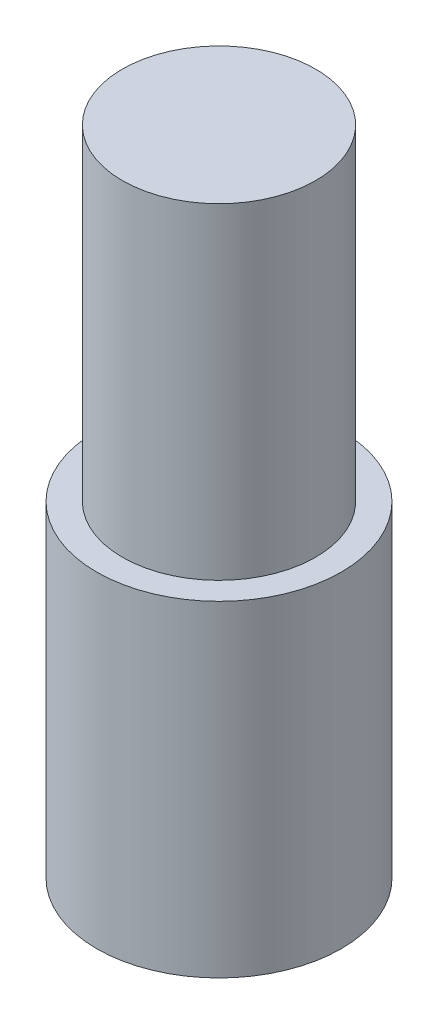
ISO-10303-21;
HEADER;
FILE_DESCRIPTION(('STEP AP214'),'2;1');
FILE_NAME('part.step','',(''),(''),'','','');
FILE_SCHEMA(('AUTOMOTIVE_DESIGN { 1 0 10303 214 1 1 1 1 }'));
ENDSEC;
DATA;
#1=APPLICATION_CONTEXT('core data for automotive mechanical design processes');
#2=APPLICATION_PROTOCOL_DEFINITION('international standard','automotive_design',2000,#1);
#3=PRODUCT_CONTEXT('',#1,'mechanical');
#4=PRODUCT('Part','Part','',(#3));
#5=PRODUCT_RELATED_PRODUCT_CATEGORY('part','',(#4));
#6=PRODUCT_DEFINITION_FORMATION('','',#4);
#7=PRODUCT_DEFINITION_CONTEXT('part definition',#1,'design');
#8=PRODUCT_DEFINITION('design','',#6,#7);
#9=PRODUCT_DEFINITION_SHAPE('','',#8);
#10=(LENGTH_UNIT() NAMED_UNIT(*) SI_UNIT(.MILLI.,.METRE.));
#11=(NAMED_UNIT(*) PLANE_ANGLE_UNIT() SI_UNIT($,.RADIAN.));
#12=(NAMED_UNIT(*) SI_UNIT($,.STERADIAN.) SOLID_ANGLE_UNIT());
#13=UNCERTAINTY_MEASURE_WITH_UNIT(LENGTH_MEASURE(1.E-05),#10,'distance_accuracy_value','');
#14=(GEOMETRIC_REPRESENTATION_CONTEXT(3) GLOBAL_UNCERTAINTY_ASSIGNED_CONTEXT((#13)) GLOBAL_UNIT_ASSIGNED_CONTEXT((#10,
#11,#12)) REPRESENTATION_CONTEXT('',''));
#15=CARTESIAN_POINT('',(0.,0.,0.));
#16=DIRECTION('',(0.,0.,1.));
#17=DIRECTION('',(1.,0.,0.));
#18=AXIS2_PLACEMENT_3D('',#15,#16,#17);
#19=CARTESIAN_POINT('',(0.,25.4,0.));
#20=DIRECTION('',(0.,-1.,0.));
#21=DIRECTION('',(0.,0.,-1.));
#22=AXIS2_PLACEMENT_3D('',#19,#20,#21);
#23=CYLINDRICAL_SURFACE('',#22,4.7625);
#24=CARTESIAN_POINT('',(0.,0.,0.));
#25=DIRECTION('',(0.,1.,0.));
#26=DIRECTION('',(0.,0.,1.));
#27=AXIS2_PLACEMENT_3D('',#24,#25,#26);
#28=CIRCLE('',#27,4.7625);
#29=CARTESIAN_POINT('',(0.,0.,4.7625));
#30=VERTEX_POINT('',#29);
#31=EDGE_CURVE('E10',#30,#30,#28,.T.);
#32=ORIENTED_EDGE('',*,*,#31,.T.);
#33=EDGE_LOOP('',(#32));
#34=FACE_BOUND('',#33,.T.);
#35=CARTESIAN_POINT('',(0.,12.7,0.));
#36=DIRECTION('',(0.,1.,0.));
#37=DIRECTION('',(0.,0.,1.));
#38=AXIS2_PLACEMENT_3D('',#35,#36,#37);
#39=CIRCLE('',#38,4.7625);
#40=CARTESIAN_POINT('',(0.,12.7,4.7625));
#41=VERTEX_POINT('',#40);
#42=EDGE_CURVE('E35',#41,#41,#39,.T.);
#43=ORIENTED_EDGE('',*,*,#42,.F.);
#44=EDGE_LOOP('',(#43));
#45=FACE_BOUND('',#44,.T.);
#46=ADVANCED_FACE('F32',(#34,#45),#23,.T.);
#47=CARTESIAN_POINT('',(0.,0.,0.));
#48=DIRECTION('',(0.,1.,0.));
#49=DIRECTION('',(0.,0.,1.));
#50=AXIS2_PLACEMENT_3D('',#47,#48,#49);
#51=PLANE('',#50);
#52=ORIENTED_EDGE('',*,*,#31,.F.);
#53=EDGE_LOOP('',(#52));
#54=FACE_BOUND('',#53,.T.);
#55=ADVANCED_FACE('F56',(#54),#51,.F.);
#56=CARTESIAN_POINT('',(0.,12.7,0.));
#57=DIRECTION('',(0.,1.,0.));
#58=DIRECTION('',(0.,0.,1.));
#59=AXIS2_PLACEMENT_3D('',#56,#57,#58);
#60=PLANE('',#59);
#61=CARTESIAN_POINT('',(0.,12.7,0.));
#62=DIRECTION('',(0.,1.,0.));
#63=DIRECTION('',(0.,0.,1.));
#64=AXIS2_PLACEMENT_3D('',#61,#62,#63);
#65=CIRCLE('',#64,3.7625);
#66=CARTESIAN_POINT('',(0.,12.7,3.7625));
#67=VERTEX_POINT('',#66);
#68=EDGE_CURVE('E42',#67,#67,#65,.T.);
#69=ORIENTED_EDGE('',*,*,#68,.F.);
#70=EDGE_LOOP('',(#69));
#71=FACE_BOUND('',#70,.T.);
#72=ORIENTED_EDGE('',*,*,#42,.T.);
#73=EDGE_LOOP('',(#72));
#74=FACE_BOUND('',#73,.T.);
#75=ADVANCED_FACE('F53',(#71,#74),#60,.T.);
#76=CARTESIAN_POINT('',(0.,12.7,0.));
#77=DIRECTION('',(0.,1.,0.));
#78=DIRECTION('',(0.,0.,1.));
#79=AXIS2_PLACEMENT_3D('',#76,#77,#78);
#80=CYLINDRICAL_SURFACE('',#79,3.7625);
#81=ORIENTED_EDGE('',*,*,#68,.T.);
#82=EDGE_LOOP('',(#81));
#83=FACE_BOUND('',#82,.T.);
#84=CARTESIAN_POINT('',(0.,25.4,0.));
#85=DIRECTION('',(0.,1.,0.));
#86=DIRECTION('',(0.,0.,1.));
#87=AXIS2_PLACEMENT_3D('',#84,#85,#86);
#88=CIRCLE('',#87,3.7625);
#89=CARTESIAN_POINT('',(0.,25.4,3.7625));
#90=VERTEX_POINT('',#89);
#91=EDGE_CURVE('E44',#90,#90,#88,.T.);
#92=ORIENTED_EDGE('',*,*,#91,.F.);
#93=EDGE_LOOP('',(#92));
#94=FACE_BOUND('',#93,.T.);
#95=ADVANCED_FACE('F50',(#83,#94),#80,.T.);
#96=CARTESIAN_POINT('',(0.,25.4,0.));
#97=DIRECTION('',(0.,1.,0.));
#98=DIRECTION('',(0.,0.,1.));
#99=AXIS2_PLACEMENT_3D('',#96,#97,#98);
#100=PLANE('',#99);
#101=ORIENTED_EDGE('',*,*,#91,.T.);
#102=EDGE_LOOP('',(#101));
#103=FACE_BOUND('',#102,.T.);
#104=ADVANCED_FACE('F68',(#103),#100,.T.);
#105=CLOSED_SHELL('',(#46,#55,#75,#95,#104));
#106=MANIFOLD_SOLID_BREP('B2',#105);
#107=ADVANCED_BREP_SHAPE_REPRESENTATION('',(#18,#106),#14);
#108=SHAPE_DEFINITION_REPRESENTATION(#9,#107);
ENDSEC;
END-ISO-10303-21;
